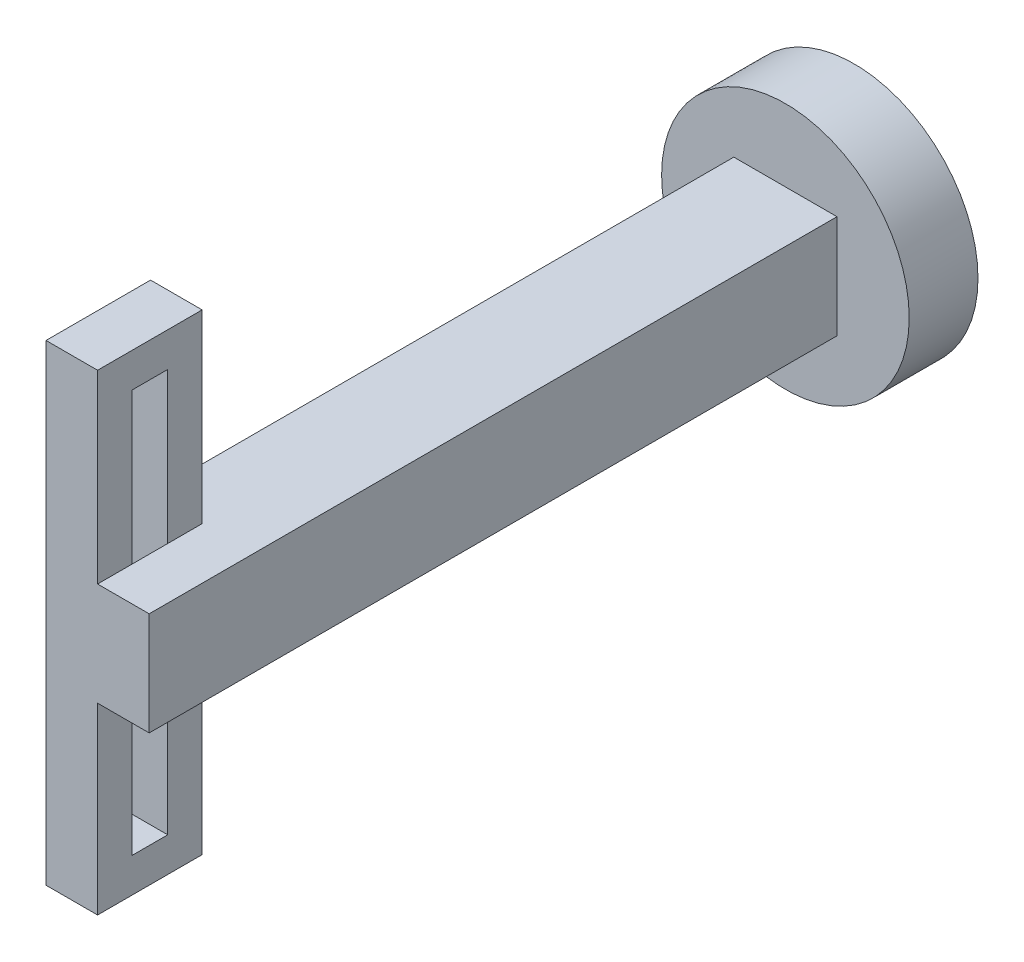
ISO-10303-21;
HEADER;
FILE_DESCRIPTION(('STEP AP214'),'2;1');
FILE_NAME('part.step','',(''),(''),'','','');
FILE_SCHEMA(('AUTOMOTIVE_DESIGN { 1 0 10303 214 1 1 1 1 }'));
ENDSEC;
DATA;
#1=APPLICATION_CONTEXT('core data for automotive mechanical design processes');
#2=APPLICATION_PROTOCOL_DEFINITION('international standard','automotive_design',2000,#1);
#3=PRODUCT_CONTEXT('',#1,'mechanical');
#4=PRODUCT('Part','Part','',(#3));
#5=PRODUCT_RELATED_PRODUCT_CATEGORY('part','',(#4));
#6=PRODUCT_DEFINITION_FORMATION('','',#4);
#7=PRODUCT_DEFINITION_CONTEXT('part definition',#1,'design');
#8=PRODUCT_DEFINITION('design','',#6,#7);
#9=PRODUCT_DEFINITION_SHAPE('','',#8);
#10=(LENGTH_UNIT() NAMED_UNIT(*) SI_UNIT(.MILLI.,.METRE.));
#11=(NAMED_UNIT(*) PLANE_ANGLE_UNIT() SI_UNIT($,.RADIAN.));
#12=(NAMED_UNIT(*) SI_UNIT($,.STERADIAN.) SOLID_ANGLE_UNIT());
#13=UNCERTAINTY_MEASURE_WITH_UNIT(LENGTH_MEASURE(1.E-05),#10,'distance_accuracy_value','');
#14=(GEOMETRIC_REPRESENTATION_CONTEXT(3) GLOBAL_UNCERTAINTY_ASSIGNED_CONTEXT((#13)) GLOBAL_UNIT_ASSIGNED_CONTEXT((#10,
#11,#12)) REPRESENTATION_CONTEXT('',''));
#15=CARTESIAN_POINT('',(0.,0.,0.));
#16=DIRECTION('',(0.,0.,1.));
#17=DIRECTION('',(1.,0.,0.));
#18=AXIS2_PLACEMENT_3D('',#15,#16,#17);
#19=CARTESIAN_POINT('',(0.,0.,2.));
#20=DIRECTION('',(0.,0.,-1.));
#21=DIRECTION('',(-1.,0.,0.));
#22=AXIS2_PLACEMENT_3D('',#19,#20,#21);
#23=CYLINDRICAL_SURFACE('',#22,3.6);
#24=CARTESIAN_POINT('',(0.,0.,2.));
#25=DIRECTION('',(0.,0.,1.));
#26=DIRECTION('',(1.,0.,0.));
#27=AXIS2_PLACEMENT_3D('',#24,#25,#26);
#28=CIRCLE('',#27,3.6);
#29=CARTESIAN_POINT('',(3.6,0.,2.));
#30=VERTEX_POINT('',#29);
#31=EDGE_CURVE('E250',#30,#30,#28,.T.);
#32=ORIENTED_EDGE('',*,*,#31,.F.);
#33=EDGE_LOOP('',(#32));
#34=FACE_BOUND('',#33,.T.);
#35=CARTESIAN_POINT('',(0.,0.,0.));
#36=DIRECTION('',(0.,0.,1.));
#37=DIRECTION('',(1.,0.,0.));
#38=AXIS2_PLACEMENT_3D('',#35,#36,#37);
#39=CIRCLE('',#38,3.6);
#40=CARTESIAN_POINT('',(3.6,0.,0.));
#41=VERTEX_POINT('',#40);
#42=EDGE_CURVE('E249',#41,#41,#39,.T.);
#43=ORIENTED_EDGE('',*,*,#42,.T.);
#44=EDGE_LOOP('',(#43));
#45=FACE_BOUND('',#44,.T.);
#46=ADVANCED_FACE('F33',(#34,#45),#23,.T.);
#47=CARTESIAN_POINT('',(0.,0.,2.));
#48=DIRECTION('',(0.,0.,1.));
#49=DIRECTION('',(1.,0.,0.));
#50=AXIS2_PLACEMENT_3D('',#47,#48,#49);
#51=PLANE('',#50);
#52=DIRECTION('',(0.,1.,0.));
#53=VECTOR('',#52,1.);
#54=CARTESIAN_POINT('',(1.5,-1.5,2.));
#55=LINE('',#54,#53);
#56=CARTESIAN_POINT('',(1.5,-1.5,2.));
#57=VERTEX_POINT('',#56);
#58=CARTESIAN_POINT('',(1.5,1.5,2.));
#59=VERTEX_POINT('',#58);
#60=EDGE_CURVE('E215',#57,#59,#55,.T.);
#61=ORIENTED_EDGE('',*,*,#60,.F.);
#62=DIRECTION('',(1.,0.,0.));
#63=VECTOR('',#62,1.);
#64=CARTESIAN_POINT('',(-1.5,-1.5,2.));
#65=LINE('',#64,#63);
#66=CARTESIAN_POINT('',(-1.5,-1.5,2.));
#67=VERTEX_POINT('',#66);
#68=EDGE_CURVE('E224',#67,#57,#65,.T.);
#69=ORIENTED_EDGE('',*,*,#68,.F.);
#70=DIRECTION('',(0.,-1.,0.));
#71=VECTOR('',#70,1.);
#72=CARTESIAN_POINT('',(-1.5,-1.5,2.));
#73=LINE('',#72,#71);
#74=CARTESIAN_POINT('',(-1.5,1.5,2.));
#75=VERTEX_POINT('',#74);
#76=EDGE_CURVE('E235',#75,#67,#73,.T.);
#77=ORIENTED_EDGE('',*,*,#76,.F.);
#78=DIRECTION('',(-1.,0.,0.));
#79=VECTOR('',#78,1.);
#80=CARTESIAN_POINT('',(-1.5,1.5,2.));
#81=LINE('',#80,#79);
#82=EDGE_CURVE('E232',#59,#75,#81,.T.);
#83=ORIENTED_EDGE('',*,*,#82,.F.);
#84=EDGE_LOOP('',(#61,#69,#77,#83));
#85=FACE_BOUND('',#84,.T.);
#86=ORIENTED_EDGE('',*,*,#31,.T.);
#87=EDGE_LOOP('',(#86));
#88=FACE_BOUND('',#87,.T.);
#89=ADVANCED_FACE('F324',(#85,#88),#51,.T.);
#90=CARTESIAN_POINT('',(0.,0.,0.));
#91=DIRECTION('',(0.,0.,1.));
#92=DIRECTION('',(1.,0.,0.));
#93=AXIS2_PLACEMENT_3D('',#90,#91,#92);
#94=PLANE('',#93);
#95=ORIENTED_EDGE('',*,*,#42,.F.);
#96=EDGE_LOOP('',(#95));
#97=FACE_BOUND('',#96,.T.);
#98=ADVANCED_FACE('F329',(#97),#94,.F.);
#99=CARTESIAN_POINT('',(1.5,-1.5,22.));
#100=DIRECTION('',(-1.,0.,0.));
#101=DIRECTION('',(0.,0.,1.));
#102=AXIS2_PLACEMENT_3D('',#99,#100,#101);
#103=PLANE('',#102);
#104=ORIENTED_EDGE('',*,*,#60,.T.);
#105=DIRECTION('',(0.,0.,-1.));
#106=VECTOR('',#105,1.);
#107=CARTESIAN_POINT('',(1.5,1.5,22.));
#108=LINE('',#107,#106);
#109=CARTESIAN_POINT('',(1.5,1.5,22.));
#110=VERTEX_POINT('',#109);
#111=EDGE_CURVE('E246',#110,#59,#108,.T.);
#112=ORIENTED_EDGE('',*,*,#111,.F.);
#113=DIRECTION('',(0.,1.,0.));
#114=VECTOR('',#113,1.);
#115=CARTESIAN_POINT('',(1.5,-1.5,22.));
#116=LINE('',#115,#114);
#117=CARTESIAN_POINT('',(1.5,-1.5,22.));
#118=VERTEX_POINT('',#117);
#119=EDGE_CURVE('E220',#118,#110,#116,.T.);
#120=ORIENTED_EDGE('',*,*,#119,.F.);
#121=DIRECTION('',(0.,0.,-1.));
#122=VECTOR('',#121,1.);
#123=CARTESIAN_POINT('',(1.5,-1.5,22.));
#124=LINE('',#123,#122);
#125=EDGE_CURVE('E229',#118,#57,#124,.T.);
#126=ORIENTED_EDGE('',*,*,#125,.T.);
#127=EDGE_LOOP('',(#104,#112,#120,#126));
#128=FACE_BOUND('',#127,.T.);
#129=ADVANCED_FACE('F288',(#128),#103,.F.);
#130=CARTESIAN_POINT('',(-1.5,1.5,22.));
#131=DIRECTION('',(0.,-1.,0.));
#132=DIRECTION('',(0.,0.,-1.));
#133=AXIS2_PLACEMENT_3D('',#130,#131,#132);
#134=PLANE('',#133);
#135=DIRECTION('',(0.,0.,-1.));
#136=VECTOR('',#135,1.);
#137=CARTESIAN_POINT('',(-1.5,1.5,22.));
#138=LINE('',#137,#136);
#139=CARTESIAN_POINT('',(-1.5,1.5,18.9600208659363));
#140=VERTEX_POINT('',#139);
#141=EDGE_CURVE('E244',#140,#75,#138,.T.);
#142=ORIENTED_EDGE('',*,*,#141,.F.);
#143=DIRECTION('',(-1.,0.,0.));
#144=VECTOR('',#143,1.);
#145=CARTESIAN_POINT('',(-1.5,1.5,18.9600208659363));
#146=LINE('',#145,#144);
#147=CARTESIAN_POINT('',(0.,1.5,18.9600208659363));
#148=VERTEX_POINT('',#147);
#149=EDGE_CURVE('E152',#148,#140,#146,.T.);
#150=ORIENTED_EDGE('',*,*,#149,.F.);
#151=DIRECTION('',(0.,0.,-1.));
#152=VECTOR('',#151,1.);
#153=CARTESIAN_POINT('',(0.,1.5,22.));
#154=LINE('',#153,#152);
#155=CARTESIAN_POINT('',(0.,1.5,19.9600208659363));
#156=VERTEX_POINT('',#155);
#157=EDGE_CURVE('E206',#156,#148,#154,.T.);
#158=ORIENTED_EDGE('',*,*,#157,.F.);
#159=CARTESIAN_POINT('',(0.,1.5,21.));
#160=VERTEX_POINT('',#159);
#161=EDGE_CURVE('E218',#160,#156,#154,.T.);
#162=ORIENTED_EDGE('',*,*,#161,.F.);
#163=CARTESIAN_POINT('',(0.,1.5,22.));
#164=VERTEX_POINT('',#163);
#165=EDGE_CURVE('E216',#164,#160,#154,.T.);
#166=ORIENTED_EDGE('',*,*,#165,.F.);
#167=DIRECTION('',(-1.,0.,0.));
#168=VECTOR('',#167,1.);
#169=CARTESIAN_POINT('',(-1.5,1.5,22.));
#170=LINE('',#169,#168);
#171=EDGE_CURVE('E223',#110,#164,#170,.T.);
#172=ORIENTED_EDGE('',*,*,#171,.F.);
#173=ORIENTED_EDGE('',*,*,#111,.T.);
#174=ORIENTED_EDGE('',*,*,#82,.T.);
#175=EDGE_LOOP('',(#142,#150,#158,#162,#166,#172,#173,#174));
#176=FACE_BOUND('',#175,.T.);
#177=ADVANCED_FACE('F291',(#176),#134,.F.);
#178=CARTESIAN_POINT('',(-1.5,-1.5,22.));
#179=DIRECTION('',(1.,0.,0.));
#180=DIRECTION('',(0.,0.,-1.));
#181=AXIS2_PLACEMENT_3D('',#178,#179,#180);
#182=PLANE('',#181);
#183=DIRECTION('',(0.,0.,-1.));
#184=VECTOR('',#183,1.);
#185=CARTESIAN_POINT('',(-1.5,-1.5,22.));
#186=LINE('',#185,#184);
#187=CARTESIAN_POINT('',(-1.5,-1.5,18.9600208659363));
#188=VERTEX_POINT('',#187);
#189=EDGE_CURVE('E242',#188,#67,#186,.T.);
#190=ORIENTED_EDGE('',*,*,#189,.F.);
#191=DIRECTION('',(0.,1.,0.));
#192=VECTOR('',#191,1.);
#193=CARTESIAN_POINT('',(-1.5,-6.83551053806863,18.9600208659363));
#194=LINE('',#193,#192);
#195=CARTESIAN_POINT('',(-1.5,-6.83551053806863,18.9600208659363));
#196=VERTEX_POINT('',#195);
#197=EDGE_CURVE('E155',#196,#188,#194,.T.);
#198=ORIENTED_EDGE('',*,*,#197,.F.);
#199=DIRECTION('',(0.,0.,-1.));
#200=VECTOR('',#199,1.);
#201=CARTESIAN_POINT('',(-1.5,-6.83551053806863,18.9600208659363));
#202=LINE('',#201,#200);
#203=CARTESIAN_POINT('',(-1.5,-6.83551053806863,22.));
#204=VERTEX_POINT('',#203);
#205=EDGE_CURVE('E185',#204,#196,#202,.T.);
#206=ORIENTED_EDGE('',*,*,#205,.F.);
#207=DIRECTION('',(0.,-1.,0.));
#208=VECTOR('',#207,1.);
#209=CARTESIAN_POINT('',(-1.5,-6.83551053806863,22.));
#210=LINE('',#209,#208);
#211=CARTESIAN_POINT('',(-1.5,6.88358701226179,22.));
#212=VERTEX_POINT('',#211);
#213=EDGE_CURVE('E164',#212,#204,#210,.T.);
#214=ORIENTED_EDGE('',*,*,#213,.F.);
#215=DIRECTION('',(0.,0.,1.));
#216=VECTOR('',#215,1.);
#217=CARTESIAN_POINT('',(-1.5,6.88358701226179,18.9600208659363));
#218=LINE('',#217,#216);
#219=CARTESIAN_POINT('',(-1.5,6.88358701226178,18.9600208659363));
#220=VERTEX_POINT('',#219);
#221=EDGE_CURVE('E159',#220,#212,#218,.T.);
#222=ORIENTED_EDGE('',*,*,#221,.F.);
#223=EDGE_CURVE('E144',#140,#220,#194,.T.);
#224=ORIENTED_EDGE('',*,*,#223,.F.);
#225=ORIENTED_EDGE('',*,*,#141,.T.);
#226=ORIENTED_EDGE('',*,*,#76,.T.);
#227=EDGE_LOOP('',(#190,#198,#206,#214,#222,#224,#225,#226));
#228=FACE_BOUND('',#227,.T.);
#229=DIRECTION('',(0.,-1.,0.));
#230=VECTOR('',#229,1.);
#231=CARTESIAN_POINT('',(-1.5,-5.83551053806863,21.));
#232=LINE('',#231,#230);
#233=CARTESIAN_POINT('',(-1.5,5.88358701226179,21.));
#234=VERTEX_POINT('',#233);
#235=CARTESIAN_POINT('',(-1.5,-5.83551053806863,21.));
#236=VERTEX_POINT('',#235);
#237=EDGE_CURVE('E197',#234,#236,#232,.T.);
#238=ORIENTED_EDGE('',*,*,#237,.T.);
#239=DIRECTION('',(0.,0.,-1.));
#240=VECTOR('',#239,1.);
#241=CARTESIAN_POINT('',(-1.5,-5.83551053806863,19.9600208659363));
#242=LINE('',#241,#240);
#243=CARTESIAN_POINT('',(-1.5,-5.83551053806863,19.9600208659363));
#244=VERTEX_POINT('',#243);
#245=EDGE_CURVE('E203',#236,#244,#242,.T.);
#246=ORIENTED_EDGE('',*,*,#245,.T.);
#247=DIRECTION('',(0.,1.,0.));
#248=VECTOR('',#247,1.);
#249=CARTESIAN_POINT('',(-1.5,-5.83551053806863,19.9600208659363));
#250=LINE('',#249,#248);
#251=CARTESIAN_POINT('',(-1.5,5.88358701226178,19.9600208659363));
#252=VERTEX_POINT('',#251);
#253=EDGE_CURVE('E207',#244,#252,#250,.T.);
#254=ORIENTED_EDGE('',*,*,#253,.T.);
#255=DIRECTION('',(0.,0.,1.));
#256=VECTOR('',#255,1.);
#257=CARTESIAN_POINT('',(-1.5,5.88358701226178,19.9600208659363));
#258=LINE('',#257,#256);
#259=EDGE_CURVE('E204',#252,#234,#258,.T.);
#260=ORIENTED_EDGE('',*,*,#259,.T.);
#261=EDGE_LOOP('',(#238,#246,#254,#260));
#262=FACE_BOUND('',#261,.T.);
#263=ADVANCED_FACE('F161',(#228,#262),#182,.F.);
#264=CARTESIAN_POINT('',(-1.5,-1.5,22.));
#265=DIRECTION('',(0.,1.,0.));
#266=DIRECTION('',(0.,0.,1.));
#267=AXIS2_PLACEMENT_3D('',#264,#265,#266);
#268=PLANE('',#267);
#269=DIRECTION('',(0.,0.,1.));
#270=VECTOR('',#269,1.);
#271=CARTESIAN_POINT('',(0.,-1.5,22.));
#272=LINE('',#271,#270);
#273=CARTESIAN_POINT('',(0.,-1.5,18.9600208659363));
#274=VERTEX_POINT('',#273);
#275=CARTESIAN_POINT('',(0.,-1.5,19.9600208659363));
#276=VERTEX_POINT('',#275);
#277=EDGE_CURVE('E209',#274,#276,#272,.T.);
#278=ORIENTED_EDGE('',*,*,#277,.F.);
#279=DIRECTION('',(1.,0.,0.));
#280=VECTOR('',#279,1.);
#281=CARTESIAN_POINT('',(-1.5,-1.5,18.9600208659363));
#282=LINE('',#281,#280);
#283=EDGE_CURVE('E211',#188,#274,#282,.T.);
#284=ORIENTED_EDGE('',*,*,#283,.F.);
#285=ORIENTED_EDGE('',*,*,#189,.T.);
#286=ORIENTED_EDGE('',*,*,#68,.T.);
#287=ORIENTED_EDGE('',*,*,#125,.F.);
#288=DIRECTION('',(1.,0.,0.));
#289=VECTOR('',#288,1.);
#290=CARTESIAN_POINT('',(-1.5,-1.5,22.));
#291=LINE('',#290,#289);
#292=CARTESIAN_POINT('',(0.,-1.5,22.));
#293=VERTEX_POINT('',#292);
#294=EDGE_CURVE('E227',#293,#118,#291,.T.);
#295=ORIENTED_EDGE('',*,*,#294,.F.);
#296=CARTESIAN_POINT('',(0.,-1.5,21.));
#297=VERTEX_POINT('',#296);
#298=EDGE_CURVE('E213',#297,#293,#272,.T.);
#299=ORIENTED_EDGE('',*,*,#298,.F.);
#300=EDGE_CURVE('E212',#276,#297,#272,.T.);
#301=ORIENTED_EDGE('',*,*,#300,.F.);
#302=EDGE_LOOP('',(#278,#284,#285,#286,#287,#295,#299,#301));
#303=FACE_BOUND('',#302,.T.);
#304=ADVANCED_FACE('F266',(#303),#268,.F.);
#305=CARTESIAN_POINT('',(0.,0.,22.));
#306=DIRECTION('',(0.,0.,-1.));
#307=DIRECTION('',(-1.,0.,0.));
#308=AXIS2_PLACEMENT_3D('',#305,#306,#307);
#309=PLANE('',#308);
#310=ORIENTED_EDGE('',*,*,#171,.T.);
#311=DIRECTION('',(0.,1.,0.));
#312=VECTOR('',#311,1.);
#313=CARTESIAN_POINT('',(0.,-6.83551053806863,22.));
#314=LINE('',#313,#312);
#315=CARTESIAN_POINT('',(0.,6.88358701226179,22.));
#316=VERTEX_POINT('',#315);
#317=EDGE_CURVE('E188',#164,#316,#314,.T.);
#318=ORIENTED_EDGE('',*,*,#317,.T.);
#319=DIRECTION('',(1.,0.,0.));
#320=VECTOR('',#319,1.);
#321=CARTESIAN_POINT('',(-15.5518721432777,6.88358701226179,22.));
#322=LINE('',#321,#320);
#323=EDGE_CURVE('E168',#212,#316,#322,.T.);
#324=ORIENTED_EDGE('',*,*,#323,.F.);
#325=ORIENTED_EDGE('',*,*,#213,.T.);
#326=DIRECTION('',(1.,0.,0.));
#327=VECTOR('',#326,1.);
#328=CARTESIAN_POINT('',(-15.5518721432777,-6.83551053806863,22.));
#329=LINE('',#328,#327);
#330=CARTESIAN_POINT('',(0.,-6.83551053806863,22.));
#331=VERTEX_POINT('',#330);
#332=EDGE_CURVE('E186',#204,#331,#329,.T.);
#333=ORIENTED_EDGE('',*,*,#332,.T.);
#334=EDGE_CURVE('E169',#331,#293,#314,.T.);
#335=ORIENTED_EDGE('',*,*,#334,.T.);
#336=ORIENTED_EDGE('',*,*,#294,.T.);
#337=ORIENTED_EDGE('',*,*,#119,.T.);
#338=EDGE_LOOP('',(#310,#318,#324,#325,#333,#335,#336,#337));
#339=FACE_BOUND('',#338,.T.);
#340=ADVANCED_FACE('F279',(#339),#309,.F.);
#341=CARTESIAN_POINT('',(0.,-4.88990754085453,22.));
#342=DIRECTION('',(1.,0.,0.));
#343=DIRECTION('',(0.,0.,-1.));
#344=AXIS2_PLACEMENT_3D('',#341,#342,#343);
#345=PLANE('',#344);
#346=ORIENTED_EDGE('',*,*,#300,.T.);
#347=DIRECTION('',(0.,1.,0.));
#348=VECTOR('',#347,1.);
#349=CARTESIAN_POINT('',(0.,-4.88990754085453,21.));
#350=LINE('',#349,#348);
#351=EDGE_CURVE('E11',#297,#160,#350,.T.);
#352=ORIENTED_EDGE('',*,*,#351,.T.);
#353=ORIENTED_EDGE('',*,*,#161,.T.);
#354=DIRECTION('',(0.,-1.,0.));
#355=VECTOR('',#354,1.);
#356=CARTESIAN_POINT('',(0.,-4.88990754085453,19.9600208659363));
#357=LINE('',#356,#355);
#358=EDGE_CURVE('E40',#156,#276,#357,.T.);
#359=ORIENTED_EDGE('',*,*,#358,.T.);
#360=EDGE_LOOP('',(#346,#352,#353,#359));
#361=FACE_BOUND('',#360,.T.);
#362=ADVANCED_FACE('F259',(#361),#345,.F.);
#363=CARTESIAN_POINT('',(0.,0.,0.));
#364=DIRECTION('',(1.,0.,0.));
#365=DIRECTION('',(0.,0.,-1.));
#366=AXIS2_PLACEMENT_3D('',#363,#364,#365);
#367=PLANE('',#366);
#368=ORIENTED_EDGE('',*,*,#157,.T.);
#369=DIRECTION('',(0.,-1.,0.));
#370=VECTOR('',#369,1.);
#371=CARTESIAN_POINT('',(0.,-6.83551053806863,18.9600208659363));
#372=LINE('',#371,#370);
#373=CARTESIAN_POINT('',(0.,6.88358701226179,18.9600208659363));
#374=VERTEX_POINT('',#373);
#375=EDGE_CURVE('E176',#374,#148,#372,.T.);
#376=ORIENTED_EDGE('',*,*,#375,.F.);
#377=DIRECTION('',(0.,0.,-1.));
#378=VECTOR('',#377,1.);
#379=CARTESIAN_POINT('',(0.,6.88358701226179,18.9600208659363));
#380=LINE('',#379,#378);
#381=EDGE_CURVE('E156',#316,#374,#380,.T.);
#382=ORIENTED_EDGE('',*,*,#381,.F.);
#383=ORIENTED_EDGE('',*,*,#317,.F.);
#384=ORIENTED_EDGE('',*,*,#165,.T.);
#385=DIRECTION('',(0.,1.,0.));
#386=VECTOR('',#385,1.);
#387=CARTESIAN_POINT('',(0.,-5.83551053806863,21.));
#388=LINE('',#387,#386);
#389=CARTESIAN_POINT('',(0.,5.88358701226179,21.));
#390=VERTEX_POINT('',#389);
#391=EDGE_CURVE('E47',#160,#390,#388,.T.);
#392=ORIENTED_EDGE('',*,*,#391,.T.);
#393=DIRECTION('',(0.,0.,-1.));
#394=VECTOR('',#393,1.);
#395=CARTESIAN_POINT('',(0.,5.88358701226178,19.9600208659363));
#396=LINE('',#395,#394);
#397=CARTESIAN_POINT('',(0.,5.88358701226178,19.9600208659363));
#398=VERTEX_POINT('',#397);
#399=EDGE_CURVE('E300',#390,#398,#396,.T.);
#400=ORIENTED_EDGE('',*,*,#399,.T.);
#401=DIRECTION('',(0.,-1.,0.));
#402=VECTOR('',#401,1.);
#403=CARTESIAN_POINT('',(0.,-5.83551053806863,19.9600208659363));
#404=LINE('',#403,#402);
#405=EDGE_CURVE('E198',#398,#156,#404,.T.);
#406=ORIENTED_EDGE('',*,*,#405,.T.);
#407=EDGE_LOOP('',(#368,#376,#382,#383,#384,#392,#400,#406));
#408=FACE_BOUND('',#407,.T.);
#409=ADVANCED_FACE('F294',(#408),#367,.T.);
#410=ORIENTED_EDGE('',*,*,#298,.T.);
#411=ORIENTED_EDGE('',*,*,#334,.F.);
#412=DIRECTION('',(0.,0.,1.));
#413=VECTOR('',#412,1.);
#414=CARTESIAN_POINT('',(0.,-6.83551053806863,18.9600208659363));
#415=LINE('',#414,#413);
#416=CARTESIAN_POINT('',(0.,-6.83551053806863,18.9600208659363));
#417=VERTEX_POINT('',#416);
#418=EDGE_CURVE('E184',#417,#331,#415,.T.);
#419=ORIENTED_EDGE('',*,*,#418,.F.);
#420=EDGE_CURVE('E174',#274,#417,#372,.T.);
#421=ORIENTED_EDGE('',*,*,#420,.F.);
#422=ORIENTED_EDGE('',*,*,#277,.T.);
#423=CARTESIAN_POINT('',(0.,-5.83551053806863,19.9600208659363));
#424=VERTEX_POINT('',#423);
#425=EDGE_CURVE('E55',#276,#424,#404,.T.);
#426=ORIENTED_EDGE('',*,*,#425,.T.);
#427=DIRECTION('',(0.,0.,1.));
#428=VECTOR('',#427,1.);
#429=CARTESIAN_POINT('',(0.,-5.83551053806863,19.9600208659363));
#430=LINE('',#429,#428);
#431=CARTESIAN_POINT('',(0.,-5.83551053806863,21.));
#432=VERTEX_POINT('',#431);
#433=EDGE_CURVE('E303',#424,#432,#430,.T.);
#434=ORIENTED_EDGE('',*,*,#433,.T.);
#435=EDGE_CURVE('E277',#432,#297,#388,.T.);
#436=ORIENTED_EDGE('',*,*,#435,.T.);
#437=EDGE_LOOP('',(#410,#411,#419,#421,#422,#426,#434,#436));
#438=FACE_BOUND('',#437,.T.);
#439=ADVANCED_FACE('F273',(#438),#367,.T.);
#440=CARTESIAN_POINT('',(-15.5518721432777,-6.83551053806863,18.9600208659363));
#441=DIRECTION('',(0.,0.,1.));
#442=DIRECTION('',(1.,0.,0.));
#443=AXIS2_PLACEMENT_3D('',#440,#441,#442);
#444=PLANE('',#443);
#445=ORIENTED_EDGE('',*,*,#375,.T.);
#446=ORIENTED_EDGE('',*,*,#149,.T.);
#447=ORIENTED_EDGE('',*,*,#223,.T.);
#448=DIRECTION('',(1.,0.,0.));
#449=VECTOR('',#448,1.);
#450=CARTESIAN_POINT('',(-15.5518721432777,6.88358701226179,18.9600208659363));
#451=LINE('',#450,#449);
#452=EDGE_CURVE('E149',#220,#374,#451,.T.);
#453=ORIENTED_EDGE('',*,*,#452,.T.);
#454=EDGE_LOOP('',(#445,#446,#447,#453));
#455=FACE_BOUND('',#454,.T.);
#456=ADVANCED_FACE('F147',(#455),#444,.F.);
#457=ORIENTED_EDGE('',*,*,#197,.T.);
#458=ORIENTED_EDGE('',*,*,#283,.T.);
#459=ORIENTED_EDGE('',*,*,#420,.T.);
#460=DIRECTION('',(1.,0.,0.));
#461=VECTOR('',#460,1.);
#462=CARTESIAN_POINT('',(-15.5518721432777,-6.83551053806863,18.9600208659363));
#463=LINE('',#462,#461);
#464=EDGE_CURVE('E181',#196,#417,#463,.T.);
#465=ORIENTED_EDGE('',*,*,#464,.F.);
#466=EDGE_LOOP('',(#457,#458,#459,#465));
#467=FACE_BOUND('',#466,.T.);
#468=ADVANCED_FACE('F366',(#467),#444,.F.);
#469=CARTESIAN_POINT('',(-15.5518721432777,6.88358701226179,18.9600208659363));
#470=DIRECTION('',(0.,-1.,0.));
#471=DIRECTION('',(0.,0.,-1.));
#472=AXIS2_PLACEMENT_3D('',#469,#470,#471);
#473=PLANE('',#472);
#474=ORIENTED_EDGE('',*,*,#452,.F.);
#475=ORIENTED_EDGE('',*,*,#221,.T.);
#476=ORIENTED_EDGE('',*,*,#323,.T.);
#477=ORIENTED_EDGE('',*,*,#381,.T.);
#478=EDGE_LOOP('',(#474,#475,#476,#477));
#479=FACE_BOUND('',#478,.T.);
#480=ADVANCED_FACE('F171',(#479),#473,.F.);
#481=CARTESIAN_POINT('',(-15.5518721432777,-6.83551053806863,18.9600208659363));
#482=DIRECTION('',(0.,1.,0.));
#483=DIRECTION('',(0.,0.,1.));
#484=AXIS2_PLACEMENT_3D('',#481,#482,#483);
#485=PLANE('',#484);
#486=ORIENTED_EDGE('',*,*,#332,.F.);
#487=ORIENTED_EDGE('',*,*,#205,.T.);
#488=ORIENTED_EDGE('',*,*,#464,.T.);
#489=ORIENTED_EDGE('',*,*,#418,.T.);
#490=EDGE_LOOP('',(#486,#487,#488,#489));
#491=FACE_BOUND('',#490,.T.);
#492=ADVANCED_FACE('F354',(#491),#485,.F.);
#493=CARTESIAN_POINT('',(-15.5518721432777,-5.83551053806863,21.));
#494=DIRECTION('',(0.,0.,-1.));
#495=DIRECTION('',(-1.,0.,0.));
#496=AXIS2_PLACEMENT_3D('',#493,#494,#495);
#497=PLANE('',#496);
#498=ORIENTED_EDGE('',*,*,#237,.F.);
#499=DIRECTION('',(1.,0.,0.));
#500=VECTOR('',#499,1.);
#501=CARTESIAN_POINT('',(-15.5518721432777,5.88358701226179,21.));
#502=LINE('',#501,#500);
#503=EDGE_CURVE('E189',#234,#390,#502,.T.);
#504=ORIENTED_EDGE('',*,*,#503,.T.);
#505=ORIENTED_EDGE('',*,*,#391,.F.);
#506=ORIENTED_EDGE('',*,*,#351,.F.);
#507=ORIENTED_EDGE('',*,*,#435,.F.);
#508=DIRECTION('',(1.,0.,0.));
#509=VECTOR('',#508,1.);
#510=CARTESIAN_POINT('',(-15.5518721432777,-5.83551053806863,21.));
#511=LINE('',#510,#509);
#512=EDGE_CURVE('E195',#236,#432,#511,.T.);
#513=ORIENTED_EDGE('',*,*,#512,.F.);
#514=EDGE_LOOP('',(#498,#504,#505,#506,#507,#513));
#515=FACE_BOUND('',#514,.T.);
#516=ADVANCED_FACE('F297',(#515),#497,.T.);
#517=CARTESIAN_POINT('',(-15.5518721432777,5.88358701226178,19.9600208659363));
#518=DIRECTION('',(0.,-1.,0.));
#519=DIRECTION('',(0.,0.,-1.));
#520=AXIS2_PLACEMENT_3D('',#517,#518,#519);
#521=PLANE('',#520);
#522=ORIENTED_EDGE('',*,*,#259,.F.);
#523=DIRECTION('',(1.,0.,0.));
#524=VECTOR('',#523,1.);
#525=CARTESIAN_POINT('',(-15.5518721432777,5.88358701226178,19.9600208659363));
#526=LINE('',#525,#524);
#527=EDGE_CURVE('E191',#252,#398,#526,.T.);
#528=ORIENTED_EDGE('',*,*,#527,.T.);
#529=ORIENTED_EDGE('',*,*,#399,.F.);
#530=ORIENTED_EDGE('',*,*,#503,.F.);
#531=EDGE_LOOP('',(#522,#528,#529,#530));
#532=FACE_BOUND('',#531,.T.);
#533=ADVANCED_FACE('F320',(#532),#521,.T.);
#534=CARTESIAN_POINT('',(-15.5518721432777,-5.83551053806863,19.9600208659363));
#535=DIRECTION('',(0.,0.,1.));
#536=DIRECTION('',(1.,0.,0.));
#537=AXIS2_PLACEMENT_3D('',#534,#535,#536);
#538=PLANE('',#537);
#539=ORIENTED_EDGE('',*,*,#253,.F.);
#540=DIRECTION('',(1.,0.,0.));
#541=VECTOR('',#540,1.);
#542=CARTESIAN_POINT('',(-15.5518721432777,-5.83551053806863,19.9600208659363));
#543=LINE('',#542,#541);
#544=EDGE_CURVE('E193',#244,#424,#543,.T.);
#545=ORIENTED_EDGE('',*,*,#544,.T.);
#546=ORIENTED_EDGE('',*,*,#425,.F.);
#547=ORIENTED_EDGE('',*,*,#358,.F.);
#548=ORIENTED_EDGE('',*,*,#405,.F.);
#549=ORIENTED_EDGE('',*,*,#527,.F.);
#550=EDGE_LOOP('',(#539,#545,#546,#547,#548,#549));
#551=FACE_BOUND('',#550,.T.);
#552=ADVANCED_FACE('F313',(#551),#538,.T.);
#553=CARTESIAN_POINT('',(-15.5518721432777,-5.83551053806863,19.9600208659363));
#554=DIRECTION('',(0.,1.,0.));
#555=DIRECTION('',(0.,0.,1.));
#556=AXIS2_PLACEMENT_3D('',#553,#554,#555);
#557=PLANE('',#556);
#558=ORIENTED_EDGE('',*,*,#245,.F.);
#559=ORIENTED_EDGE('',*,*,#512,.T.);
#560=ORIENTED_EDGE('',*,*,#433,.F.);
#561=ORIENTED_EDGE('',*,*,#544,.F.);
#562=EDGE_LOOP('',(#558,#559,#560,#561));
#563=FACE_BOUND('',#562,.T.);
#564=ADVANCED_FACE('F314',(#563),#557,.T.);
#565=CLOSED_SHELL('',(#46,#89,#98,#129,#177,#263,#304,#340,#362,#409,#439,#456,#468,#480,#492,
#516,#533,#552,#564));
#566=MANIFOLD_SOLID_BREP('B2',#565);
#567=ADVANCED_BREP_SHAPE_REPRESENTATION('',(#18,#566),#14);
#568=SHAPE_DEFINITION_REPRESENTATION(#9,#567);
ENDSEC;
END-ISO-10303-21;
